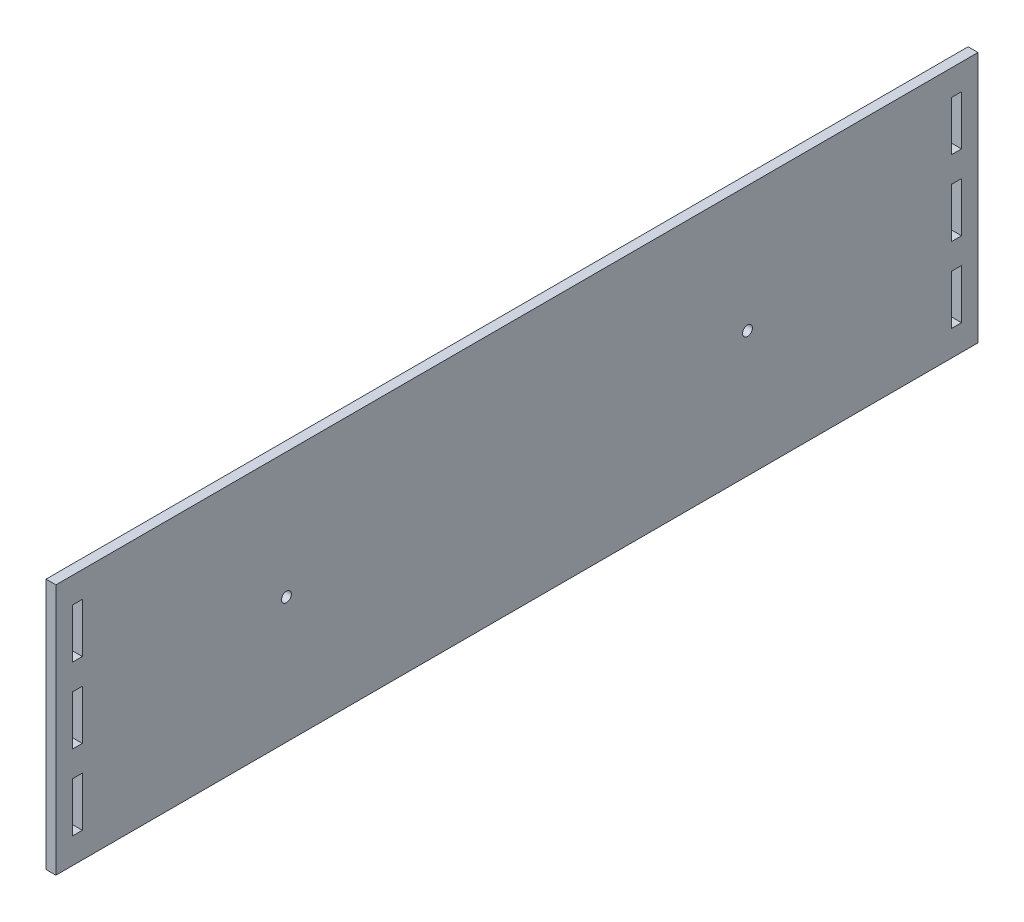
ISO-10303-21;
HEADER;
FILE_DESCRIPTION(('STEP AP214'),'2;1');
FILE_NAME('part.step','',(''),(''),'','','');
FILE_SCHEMA(('AUTOMOTIVE_DESIGN { 1 0 10303 214 1 1 1 1 }'));
ENDSEC;
DATA;
#1=APPLICATION_CONTEXT('core data for automotive mechanical design processes');
#2=APPLICATION_PROTOCOL_DEFINITION('international standard','automotive_design',2000,#1);
#3=PRODUCT_CONTEXT('',#1,'mechanical');
#4=PRODUCT('Part','Part','',(#3));
#5=PRODUCT_RELATED_PRODUCT_CATEGORY('part','',(#4));
#6=PRODUCT_DEFINITION_FORMATION('','',#4);
#7=PRODUCT_DEFINITION_CONTEXT('part definition',#1,'design');
#8=PRODUCT_DEFINITION('design','',#6,#7);
#9=PRODUCT_DEFINITION_SHAPE('','',#8);
#10=(LENGTH_UNIT() NAMED_UNIT(*) SI_UNIT(.MILLI.,.METRE.));
#11=(NAMED_UNIT(*) PLANE_ANGLE_UNIT() SI_UNIT($,.RADIAN.));
#12=(NAMED_UNIT(*) SI_UNIT($,.STERADIAN.) SOLID_ANGLE_UNIT());
#13=UNCERTAINTY_MEASURE_WITH_UNIT(LENGTH_MEASURE(1.E-05),#10,'distance_accuracy_value','');
#14=(GEOMETRIC_REPRESENTATION_CONTEXT(3) GLOBAL_UNCERTAINTY_ASSIGNED_CONTEXT((#13)) GLOBAL_UNIT_ASSIGNED_CONTEXT((#10,
#11,#12)) REPRESENTATION_CONTEXT('',''));
#15=CARTESIAN_POINT('',(0.,0.,0.));
#16=DIRECTION('',(0.,0.,1.));
#17=DIRECTION('',(1.,0.,0.));
#18=AXIS2_PLACEMENT_3D('',#15,#16,#17);
#19=CARTESIAN_POINT('',(-3.,0.,0.));
#20=DIRECTION('',(-1.,0.,0.));
#21=DIRECTION('',(0.,0.,1.));
#22=AXIS2_PLACEMENT_3D('',#19,#20,#21);
#23=PLANE('',#22);
#24=CARTESIAN_POINT('',(-3.,0.,-69.85));
#25=DIRECTION('',(-1.,0.,0.));
#26=DIRECTION('',(0.,0.,1.));
#27=AXIS2_PLACEMENT_3D('',#24,#25,#26);
#28=CIRCLE('',#27,1.5);
#29=CARTESIAN_POINT('',(-3.,0.,-68.35));
#30=VERTEX_POINT('',#29);
#31=EDGE_CURVE('E823',#30,#30,#28,.T.);
#32=ORIENTED_EDGE('',*,*,#31,.F.);
#33=EDGE_LOOP('',(#32));
#34=FACE_BOUND('',#33,.T.);
#35=CARTESIAN_POINT('',(-3.,0.,69.8500000000001));
#36=DIRECTION('',(-1.,0.,0.));
#37=DIRECTION('',(0.,0.,1.));
#38=AXIS2_PLACEMENT_3D('',#35,#36,#37);
#39=CIRCLE('',#38,1.5);
#40=CARTESIAN_POINT('',(-3.,0.,71.3500000000001));
#41=VERTEX_POINT('',#40);
#42=EDGE_CURVE('E825',#41,#41,#39,.T.);
#43=ORIENTED_EDGE('',*,*,#42,.F.);
#44=EDGE_LOOP('',(#43));
#45=FACE_BOUND('',#44,.T.);
#46=DIRECTION('',(0.,1.,0.));
#47=VECTOR('',#46,1.);
#48=CARTESIAN_POINT('',(-3.,7.50000000000002,134.7));
#49=LINE('',#48,#47);
#50=CARTESIAN_POINT('',(-3.,-7.49999999999998,134.7));
#51=VERTEX_POINT('',#50);
#52=CARTESIAN_POINT('',(-3.,7.50000000000002,134.7));
#53=VERTEX_POINT('',#52);
#54=EDGE_CURVE('E347',#51,#53,#49,.T.);
#55=ORIENTED_EDGE('',*,*,#54,.F.);
#56=DIRECTION('',(0.,0.,1.));
#57=VECTOR('',#56,1.);
#58=CARTESIAN_POINT('',(-3.,-7.49999999999998,134.7));
#59=LINE('',#58,#57);
#60=CARTESIAN_POINT('',(-3.,-7.49999999999997,131.7));
#61=VERTEX_POINT('',#60);
#62=EDGE_CURVE('E339',#61,#51,#59,.T.);
#63=ORIENTED_EDGE('',*,*,#62,.F.);
#64=DIRECTION('',(0.,-1.,0.));
#65=VECTOR('',#64,1.);
#66=CARTESIAN_POINT('',(-3.,7.50000000000003,131.7));
#67=LINE('',#66,#65);
#68=CARTESIAN_POINT('',(-3.,7.50000000000003,131.7));
#69=VERTEX_POINT('',#68);
#70=EDGE_CURVE('E331',#69,#61,#67,.T.);
#71=ORIENTED_EDGE('',*,*,#70,.F.);
#72=DIRECTION('',(0.,0.,-1.));
#73=VECTOR('',#72,1.);
#74=CARTESIAN_POINT('',(-3.,7.50000000000002,134.7));
#75=LINE('',#74,#73);
#76=EDGE_CURVE('E260',#53,#69,#75,.T.);
#77=ORIENTED_EDGE('',*,*,#76,.F.);
#78=EDGE_LOOP('',(#55,#63,#71,#77));
#79=FACE_BOUND('',#78,.T.);
#80=DIRECTION('',(0.,1.,0.));
#81=VECTOR('',#80,1.);
#82=CARTESIAN_POINT('',(-3.,30.3,134.7));
#83=LINE('',#82,#81);
#84=CARTESIAN_POINT('',(-3.,15.3,134.7));
#85=VERTEX_POINT('',#84);
#86=CARTESIAN_POINT('',(-3.,30.3,134.7));
#87=VERTEX_POINT('',#86);
#88=EDGE_CURVE('E352',#85,#87,#83,.T.);
#89=ORIENTED_EDGE('',*,*,#88,.F.);
#90=DIRECTION('',(0.,0.,1.));
#91=VECTOR('',#90,1.);
#92=CARTESIAN_POINT('',(-3.,15.3,134.7));
#93=LINE('',#92,#91);
#94=CARTESIAN_POINT('',(-3.,15.3,131.7));
#95=VERTEX_POINT('',#94);
#96=EDGE_CURVE('E357',#95,#85,#93,.T.);
#97=ORIENTED_EDGE('',*,*,#96,.F.);
#98=DIRECTION('',(0.,-1.,0.));
#99=VECTOR('',#98,1.);
#100=CARTESIAN_POINT('',(-3.,30.3,131.7));
#101=LINE('',#100,#99);
#102=CARTESIAN_POINT('',(-3.,30.3,131.7));
#103=VERTEX_POINT('',#102);
#104=EDGE_CURVE('E371',#103,#95,#101,.T.);
#105=ORIENTED_EDGE('',*,*,#104,.F.);
#106=DIRECTION('',(0.,0.,-1.));
#107=VECTOR('',#106,1.);
#108=CARTESIAN_POINT('',(-3.,30.3,134.7));
#109=LINE('',#108,#107);
#110=EDGE_CURVE('E368',#87,#103,#109,.T.);
#111=ORIENTED_EDGE('',*,*,#110,.F.);
#112=EDGE_LOOP('',(#89,#97,#105,#111));
#113=FACE_BOUND('',#112,.T.);
#114=DIRECTION('',(0.,0.,-1.));
#115=VECTOR('',#114,1.);
#116=CARTESIAN_POINT('',(-3.,38.1,139.7));
#117=LINE('',#116,#115);
#118=CARTESIAN_POINT('',(-3.,38.1,139.7));
#119=VERTEX_POINT('',#118);
#120=CARTESIAN_POINT('',(-3.,38.1,-139.7));
#121=VERTEX_POINT('',#120);
#122=EDGE_CURVE('E385',#119,#121,#117,.T.);
#123=ORIENTED_EDGE('',*,*,#122,.T.);
#124=DIRECTION('',(0.,-1.,0.));
#125=VECTOR('',#124,1.);
#126=CARTESIAN_POINT('',(-3.,38.1,-139.7));
#127=LINE('',#126,#125);
#128=CARTESIAN_POINT('',(-3.,-38.1,-139.7));
#129=VERTEX_POINT('',#128);
#130=EDGE_CURVE('E388',#121,#129,#127,.T.);
#131=ORIENTED_EDGE('',*,*,#130,.T.);
#132=DIRECTION('',(0.,0.,-1.));
#133=VECTOR('',#132,1.);
#134=CARTESIAN_POINT('',(-3.,-38.1,139.7));
#135=LINE('',#134,#133);
#136=CARTESIAN_POINT('',(-3.,-38.1,139.7));
#137=VERTEX_POINT('',#136);
#138=EDGE_CURVE('E391',#137,#129,#135,.T.);
#139=ORIENTED_EDGE('',*,*,#138,.F.);
#140=DIRECTION('',(0.,-1.,0.));
#141=VECTOR('',#140,1.);
#142=CARTESIAN_POINT('',(-3.,38.1,139.7));
#143=LINE('',#142,#141);
#144=EDGE_CURVE('E394',#119,#137,#143,.T.);
#145=ORIENTED_EDGE('',*,*,#144,.F.);
#146=EDGE_LOOP('',(#123,#131,#139,#145));
#147=FACE_BOUND('',#146,.T.);
#148=DIRECTION('',(0.,1.,0.));
#149=VECTOR('',#148,1.);
#150=CARTESIAN_POINT('',(-3.,-15.3,134.7));
#151=LINE('',#150,#149);
#152=CARTESIAN_POINT('',(-3.,-30.3,134.7));
#153=VERTEX_POINT('',#152);
#154=CARTESIAN_POINT('',(-3.,-15.3,134.7));
#155=VERTEX_POINT('',#154);
#156=EDGE_CURVE('E416',#153,#155,#151,.T.);
#157=ORIENTED_EDGE('',*,*,#156,.F.);
#158=DIRECTION('',(0.,0.,1.));
#159=VECTOR('',#158,1.);
#160=CARTESIAN_POINT('',(-3.,-30.3,134.7));
#161=LINE('',#160,#159);
#162=CARTESIAN_POINT('',(-3.,-30.3,131.7));
#163=VERTEX_POINT('',#162);
#164=EDGE_CURVE('E418',#163,#153,#161,.T.);
#165=ORIENTED_EDGE('',*,*,#164,.F.);
#166=DIRECTION('',(0.,-1.,0.));
#167=VECTOR('',#166,1.);
#168=CARTESIAN_POINT('',(-3.,-15.3,131.7));
#169=LINE('',#168,#167);
#170=CARTESIAN_POINT('',(-3.,-15.3,131.7));
#171=VERTEX_POINT('',#170);
#172=EDGE_CURVE('E421',#171,#163,#169,.T.);
#173=ORIENTED_EDGE('',*,*,#172,.F.);
#174=DIRECTION('',(0.,0.,-1.));
#175=VECTOR('',#174,1.);
#176=CARTESIAN_POINT('',(-3.,-15.3,134.7));
#177=LINE('',#176,#175);
#178=EDGE_CURVE('E424',#155,#171,#177,.T.);
#179=ORIENTED_EDGE('',*,*,#178,.F.);
#180=EDGE_LOOP('',(#157,#165,#173,#179));
#181=FACE_BOUND('',#180,.T.);
#182=DIRECTION('',(0.,0.,-1.));
#183=VECTOR('',#182,1.);
#184=CARTESIAN_POINT('',(-3.,-30.3,-134.7));
#185=LINE('',#184,#183);
#186=CARTESIAN_POINT('',(-3.,-30.3,-131.7));
#187=VERTEX_POINT('',#186);
#188=CARTESIAN_POINT('',(-3.,-30.3,-134.7));
#189=VERTEX_POINT('',#188);
#190=EDGE_CURVE('E305',#187,#189,#185,.T.);
#191=ORIENTED_EDGE('',*,*,#190,.T.);
#192=DIRECTION('',(0.,1.,0.));
#193=VECTOR('',#192,1.);
#194=CARTESIAN_POINT('',(-3.,-15.3,-134.7));
#195=LINE('',#194,#193);
#196=CARTESIAN_POINT('',(-3.,-15.3,-134.7));
#197=VERTEX_POINT('',#196);
#198=EDGE_CURVE('E302',#189,#197,#195,.T.);
#199=ORIENTED_EDGE('',*,*,#198,.T.);
#200=DIRECTION('',(0.,0.,1.));
#201=VECTOR('',#200,1.);
#202=CARTESIAN_POINT('',(-3.,-15.3,-134.7));
#203=LINE('',#202,#201);
#204=CARTESIAN_POINT('',(-3.,-15.3,-131.7));
#205=VERTEX_POINT('',#204);
#206=EDGE_CURVE('E294',#197,#205,#203,.T.);
#207=ORIENTED_EDGE('',*,*,#206,.T.);
#208=DIRECTION('',(0.,-1.,0.));
#209=VECTOR('',#208,1.);
#210=CARTESIAN_POINT('',(-3.,-15.3,-131.7));
#211=LINE('',#210,#209);
#212=EDGE_CURVE('E308',#205,#187,#211,.T.);
#213=ORIENTED_EDGE('',*,*,#212,.T.);
#214=EDGE_LOOP('',(#191,#199,#207,#213));
#215=FACE_BOUND('',#214,.T.);
#216=DIRECTION('',(0.,0.,-1.));
#217=VECTOR('',#216,1.);
#218=CARTESIAN_POINT('',(-3.,-7.49999999999998,-134.7));
#219=LINE('',#218,#217);
#220=CARTESIAN_POINT('',(-3.,-7.49999999999997,-131.7));
#221=VERTEX_POINT('',#220);
#222=CARTESIAN_POINT('',(-3.,-7.49999999999998,-134.7));
#223=VERTEX_POINT('',#222);
#224=EDGE_CURVE('E276',#221,#223,#219,.T.);
#225=ORIENTED_EDGE('',*,*,#224,.T.);
#226=DIRECTION('',(0.,1.,0.));
#227=VECTOR('',#226,1.);
#228=CARTESIAN_POINT('',(-3.,7.50000000000002,-134.7));
#229=LINE('',#228,#227);
#230=CARTESIAN_POINT('',(-3.,7.50000000000002,-134.7));
#231=VERTEX_POINT('',#230);
#232=EDGE_CURVE('E57',#223,#231,#229,.T.);
#233=ORIENTED_EDGE('',*,*,#232,.T.);
#234=DIRECTION('',(0.,0.,1.));
#235=VECTOR('',#234,1.);
#236=CARTESIAN_POINT('',(-3.,7.50000000000002,-134.7));
#237=LINE('',#236,#235);
#238=CARTESIAN_POINT('',(-3.,7.50000000000003,-131.7));
#239=VERTEX_POINT('',#238);
#240=EDGE_CURVE('E267',#231,#239,#237,.T.);
#241=ORIENTED_EDGE('',*,*,#240,.T.);
#242=DIRECTION('',(0.,-1.,0.));
#243=VECTOR('',#242,1.);
#244=CARTESIAN_POINT('',(-3.,7.50000000000003,-131.7));
#245=LINE('',#244,#243);
#246=EDGE_CURVE('E280',#239,#221,#245,.T.);
#247=ORIENTED_EDGE('',*,*,#246,.T.);
#248=EDGE_LOOP('',(#225,#233,#241,#247));
#249=FACE_BOUND('',#248,.T.);
#250=DIRECTION('',(0.,0.,-1.));
#251=VECTOR('',#250,1.);
#252=CARTESIAN_POINT('',(-3.,15.3,-134.7));
#253=LINE('',#252,#251);
#254=CARTESIAN_POINT('',(-3.,15.3,-131.7));
#255=VERTEX_POINT('',#254);
#256=CARTESIAN_POINT('',(-3.,15.3,-134.7));
#257=VERTEX_POINT('',#256);
#258=EDGE_CURVE('E253',#255,#257,#253,.T.);
#259=ORIENTED_EDGE('',*,*,#258,.T.);
#260=DIRECTION('',(0.,1.,0.));
#261=VECTOR('',#260,1.);
#262=CARTESIAN_POINT('',(-3.,30.3,-134.7));
#263=LINE('',#262,#261);
#264=CARTESIAN_POINT('',(-3.,30.3,-134.7));
#265=VERTEX_POINT('',#264);
#266=EDGE_CURVE('E49',#257,#265,#263,.T.);
#267=ORIENTED_EDGE('',*,*,#266,.T.);
#268=DIRECTION('',(0.,0.,1.));
#269=VECTOR('',#268,1.);
#270=CARTESIAN_POINT('',(-3.,30.3,-134.7));
#271=LINE('',#270,#269);
#272=CARTESIAN_POINT('',(-3.,30.3,-131.7));
#273=VERTEX_POINT('',#272);
#274=EDGE_CURVE('E241',#265,#273,#271,.T.);
#275=ORIENTED_EDGE('',*,*,#274,.T.);
#276=DIRECTION('',(0.,-1.,0.));
#277=VECTOR('',#276,1.);
#278=CARTESIAN_POINT('',(-3.,30.3,-131.7));
#279=LINE('',#278,#277);
#280=EDGE_CURVE('E244',#273,#255,#279,.T.);
#281=ORIENTED_EDGE('',*,*,#280,.T.);
#282=EDGE_LOOP('',(#259,#267,#275,#281));
#283=FACE_BOUND('',#282,.T.);
#284=ADVANCED_FACE('F34',(#34,#45,#79,#113,#147,#181,#215,#249,#283),#23,.T.);
#285=CARTESIAN_POINT('',(0.,0.,0.));
#286=DIRECTION('',(-1.,0.,0.));
#287=DIRECTION('',(0.,0.,1.));
#288=AXIS2_PLACEMENT_3D('',#285,#286,#287);
#289=PLANE('',#288);
#290=CARTESIAN_POINT('',(0.,0.,-69.85));
#291=DIRECTION('',(-1.,0.,0.));
#292=DIRECTION('',(0.,0.,1.));
#293=AXIS2_PLACEMENT_3D('',#290,#291,#292);
#294=CIRCLE('',#293,1.5);
#295=CARTESIAN_POINT('',(0.,0.,-68.35));
#296=VERTEX_POINT('',#295);
#297=EDGE_CURVE('E821',#296,#296,#294,.T.);
#298=ORIENTED_EDGE('',*,*,#297,.T.);
#299=EDGE_LOOP('',(#298));
#300=FACE_BOUND('',#299,.T.);
#301=CARTESIAN_POINT('',(0.,0.,69.8500000000001));
#302=DIRECTION('',(-1.,0.,0.));
#303=DIRECTION('',(0.,0.,1.));
#304=AXIS2_PLACEMENT_3D('',#301,#302,#303);
#305=CIRCLE('',#304,1.5);
#306=CARTESIAN_POINT('',(0.,0.,71.3500000000001));
#307=VERTEX_POINT('',#306);
#308=EDGE_CURVE('E247',#307,#307,#305,.T.);
#309=ORIENTED_EDGE('',*,*,#308,.T.);
#310=EDGE_LOOP('',(#309));
#311=FACE_BOUND('',#310,.T.);
#312=DIRECTION('',(0.,1.,0.));
#313=VECTOR('',#312,1.);
#314=CARTESIAN_POINT('',(0.,7.50000000000002,-134.7));
#315=LINE('',#314,#313);
#316=CARTESIAN_POINT('',(0.,-7.49999999999998,-134.7));
#317=VERTEX_POINT('',#316);
#318=CARTESIAN_POINT('',(0.,7.50000000000002,-134.7));
#319=VERTEX_POINT('',#318);
#320=EDGE_CURVE('E264',#317,#319,#315,.T.);
#321=ORIENTED_EDGE('',*,*,#320,.F.);
#322=DIRECTION('',(0.,0.,-1.));
#323=VECTOR('',#322,1.);
#324=CARTESIAN_POINT('',(0.,-7.49999999999998,-134.7));
#325=LINE('',#324,#323);
#326=CARTESIAN_POINT('',(0.,-7.49999999999997,-131.7));
#327=VERTEX_POINT('',#326);
#328=EDGE_CURVE('E266',#327,#317,#325,.T.);
#329=ORIENTED_EDGE('',*,*,#328,.F.);
#330=DIRECTION('',(0.,-1.,0.));
#331=VECTOR('',#330,1.);
#332=CARTESIAN_POINT('',(0.,7.50000000000003,-131.7));
#333=LINE('',#332,#331);
#334=CARTESIAN_POINT('',(0.,7.50000000000003,-131.7));
#335=VERTEX_POINT('',#334);
#336=EDGE_CURVE('E269',#335,#327,#333,.T.);
#337=ORIENTED_EDGE('',*,*,#336,.F.);
#338=DIRECTION('',(0.,0.,1.));
#339=VECTOR('',#338,1.);
#340=CARTESIAN_POINT('',(0.,7.50000000000002,-134.7));
#341=LINE('',#340,#339);
#342=EDGE_CURVE('E272',#319,#335,#341,.T.);
#343=ORIENTED_EDGE('',*,*,#342,.F.);
#344=EDGE_LOOP('',(#321,#329,#337,#343));
#345=FACE_BOUND('',#344,.T.);
#346=DIRECTION('',(0.,1.,0.));
#347=VECTOR('',#346,1.);
#348=CARTESIAN_POINT('',(0.,-15.3,134.7));
#349=LINE('',#348,#347);
#350=CARTESIAN_POINT('',(0.,-30.3,134.7));
#351=VERTEX_POINT('',#350);
#352=CARTESIAN_POINT('',(0.,-15.3,134.7));
#353=VERTEX_POINT('',#352);
#354=EDGE_CURVE('E427',#351,#353,#349,.T.);
#355=ORIENTED_EDGE('',*,*,#354,.T.);
#356=DIRECTION('',(0.,0.,-1.));
#357=VECTOR('',#356,1.);
#358=CARTESIAN_POINT('',(0.,-15.3,134.7));
#359=LINE('',#358,#357);
#360=CARTESIAN_POINT('',(0.,-15.3,131.7));
#361=VERTEX_POINT('',#360);
#362=EDGE_CURVE('E429',#353,#361,#359,.T.);
#363=ORIENTED_EDGE('',*,*,#362,.T.);
#364=DIRECTION('',(0.,-1.,0.));
#365=VECTOR('',#364,1.);
#366=CARTESIAN_POINT('',(0.,-15.3,131.7));
#367=LINE('',#366,#365);
#368=CARTESIAN_POINT('',(0.,-30.3,131.7));
#369=VERTEX_POINT('',#368);
#370=EDGE_CURVE('E431',#361,#369,#367,.T.);
#371=ORIENTED_EDGE('',*,*,#370,.T.);
#372=DIRECTION('',(0.,0.,1.));
#373=VECTOR('',#372,1.);
#374=CARTESIAN_POINT('',(0.,-30.3,134.7));
#375=LINE('',#374,#373);
#376=EDGE_CURVE('E433',#369,#351,#375,.T.);
#377=ORIENTED_EDGE('',*,*,#376,.T.);
#378=EDGE_LOOP('',(#355,#363,#371,#377));
#379=FACE_BOUND('',#378,.T.);
#380=DIRECTION('',(0.,0.,-1.));
#381=VECTOR('',#380,1.);
#382=CARTESIAN_POINT('',(0.,38.1,139.7));
#383=LINE('',#382,#381);
#384=CARTESIAN_POINT('',(0.,38.1,139.7));
#385=VERTEX_POINT('',#384);
#386=CARTESIAN_POINT('',(0.,38.1,-139.7));
#387=VERTEX_POINT('',#386);
#388=EDGE_CURVE('E378',#385,#387,#383,.T.);
#389=ORIENTED_EDGE('',*,*,#388,.F.);
#390=DIRECTION('',(0.,-1.,0.));
#391=VECTOR('',#390,1.);
#392=CARTESIAN_POINT('',(0.,38.1,139.7));
#393=LINE('',#392,#391);
#394=CARTESIAN_POINT('',(0.,-38.1,139.7));
#395=VERTEX_POINT('',#394);
#396=EDGE_CURVE('E389',#385,#395,#393,.T.);
#397=ORIENTED_EDGE('',*,*,#396,.T.);
#398=DIRECTION('',(0.,0.,-1.));
#399=VECTOR('',#398,1.);
#400=CARTESIAN_POINT('',(0.,-38.1,139.7));
#401=LINE('',#400,#399);
#402=CARTESIAN_POINT('',(0.,-38.1,-139.7));
#403=VERTEX_POINT('',#402);
#404=EDGE_CURVE('E403',#395,#403,#401,.T.);
#405=ORIENTED_EDGE('',*,*,#404,.T.);
#406=DIRECTION('',(0.,-1.,0.));
#407=VECTOR('',#406,1.);
#408=CARTESIAN_POINT('',(0.,38.1,-139.7));
#409=LINE('',#408,#407);
#410=EDGE_CURVE('E400',#387,#403,#409,.T.);
#411=ORIENTED_EDGE('',*,*,#410,.F.);
#412=EDGE_LOOP('',(#389,#397,#405,#411));
#413=FACE_BOUND('',#412,.T.);
#414=DIRECTION('',(0.,0.,1.));
#415=VECTOR('',#414,1.);
#416=CARTESIAN_POINT('',(0.,15.3,134.7));
#417=LINE('',#416,#415);
#418=CARTESIAN_POINT('',(0.,15.3,131.7));
#419=VERTEX_POINT('',#418);
#420=CARTESIAN_POINT('',(0.,15.3,134.7));
#421=VERTEX_POINT('',#420);
#422=EDGE_CURVE('E363',#419,#421,#417,.T.);
#423=ORIENTED_EDGE('',*,*,#422,.T.);
#424=DIRECTION('',(0.,1.,0.));
#425=VECTOR('',#424,1.);
#426=CARTESIAN_POINT('',(0.,30.3,134.7));
#427=LINE('',#426,#425);
#428=CARTESIAN_POINT('',(0.,30.3,134.7));
#429=VERTEX_POINT('',#428);
#430=EDGE_CURVE('E353',#421,#429,#427,.T.);
#431=ORIENTED_EDGE('',*,*,#430,.T.);
#432=DIRECTION('',(0.,0.,-1.));
#433=VECTOR('',#432,1.);
#434=CARTESIAN_POINT('',(0.,30.3,134.7));
#435=LINE('',#434,#433);
#436=CARTESIAN_POINT('',(0.,30.3,131.7));
#437=VERTEX_POINT('',#436);
#438=EDGE_CURVE('E356',#429,#437,#435,.T.);
#439=ORIENTED_EDGE('',*,*,#438,.T.);
#440=DIRECTION('',(0.,-1.,0.));
#441=VECTOR('',#440,1.);
#442=CARTESIAN_POINT('',(0.,30.3,131.7));
#443=LINE('',#442,#441);
#444=EDGE_CURVE('E360',#437,#419,#443,.T.);
#445=ORIENTED_EDGE('',*,*,#444,.T.);
#446=EDGE_LOOP('',(#423,#431,#439,#445));
#447=FACE_BOUND('',#446,.T.);
#448=DIRECTION('',(0.,0.,1.));
#449=VECTOR('',#448,1.);
#450=CARTESIAN_POINT('',(0.,-7.49999999999998,134.7));
#451=LINE('',#450,#449);
#452=CARTESIAN_POINT('',(0.,-7.49999999999997,131.7));
#453=VERTEX_POINT('',#452);
#454=CARTESIAN_POINT('',(0.,-7.49999999999998,134.7));
#455=VERTEX_POINT('',#454);
#456=EDGE_CURVE('E344',#453,#455,#451,.T.);
#457=ORIENTED_EDGE('',*,*,#456,.T.);
#458=DIRECTION('',(0.,1.,0.));
#459=VECTOR('',#458,1.);
#460=CARTESIAN_POINT('',(0.,7.50000000000002,134.7));
#461=LINE('',#460,#459);
#462=CARTESIAN_POINT('',(0.,7.50000000000002,134.7));
#463=VERTEX_POINT('',#462);
#464=EDGE_CURVE('E349',#455,#463,#461,.T.);
#465=ORIENTED_EDGE('',*,*,#464,.T.);
#466=DIRECTION('',(0.,0.,-1.));
#467=VECTOR('',#466,1.);
#468=CARTESIAN_POINT('',(0.,7.50000000000002,134.7));
#469=LINE('',#468,#467);
#470=CARTESIAN_POINT('',(0.,7.50000000000003,131.7));
#471=VERTEX_POINT('',#470);
#472=EDGE_CURVE('E322',#463,#471,#469,.T.);
#473=ORIENTED_EDGE('',*,*,#472,.T.);
#474=DIRECTION('',(0.,-1.,0.));
#475=VECTOR('',#474,1.);
#476=CARTESIAN_POINT('',(0.,7.50000000000003,131.7));
#477=LINE('',#476,#475);
#478=EDGE_CURVE('E336',#471,#453,#477,.T.);
#479=ORIENTED_EDGE('',*,*,#478,.T.);
#480=EDGE_LOOP('',(#457,#465,#473,#479));
#481=FACE_BOUND('',#480,.T.);
#482=DIRECTION('',(0.,1.,0.));
#483=VECTOR('',#482,1.);
#484=CARTESIAN_POINT('',(0.,-15.3,-134.7));
#485=LINE('',#484,#483);
#486=CARTESIAN_POINT('',(0.,-30.3,-134.7));
#487=VERTEX_POINT('',#486);
#488=CARTESIAN_POINT('',(0.,-15.3,-134.7));
#489=VERTEX_POINT('',#488);
#490=EDGE_CURVE('E291',#487,#489,#485,.T.);
#491=ORIENTED_EDGE('',*,*,#490,.F.);
#492=DIRECTION('',(0.,0.,-1.));
#493=VECTOR('',#492,1.);
#494=CARTESIAN_POINT('',(0.,-30.3,-134.7));
#495=LINE('',#494,#493);
#496=CARTESIAN_POINT('',(0.,-30.3,-131.7));
#497=VERTEX_POINT('',#496);
#498=EDGE_CURVE('E293',#497,#487,#495,.T.);
#499=ORIENTED_EDGE('',*,*,#498,.F.);
#500=DIRECTION('',(0.,-1.,0.));
#501=VECTOR('',#500,1.);
#502=CARTESIAN_POINT('',(0.,-15.3,-131.7));
#503=LINE('',#502,#501);
#504=CARTESIAN_POINT('',(0.,-15.3,-131.7));
#505=VERTEX_POINT('',#504);
#506=EDGE_CURVE('E296',#505,#497,#503,.T.);
#507=ORIENTED_EDGE('',*,*,#506,.F.);
#508=DIRECTION('',(0.,0.,1.));
#509=VECTOR('',#508,1.);
#510=CARTESIAN_POINT('',(0.,-15.3,-134.7));
#511=LINE('',#510,#509);
#512=EDGE_CURVE('E299',#489,#505,#511,.T.);
#513=ORIENTED_EDGE('',*,*,#512,.F.);
#514=EDGE_LOOP('',(#491,#499,#507,#513));
#515=FACE_BOUND('',#514,.T.);
#516=DIRECTION('',(0.,1.,0.));
#517=VECTOR('',#516,1.);
#518=CARTESIAN_POINT('',(0.,30.3,-134.7));
#519=LINE('',#518,#517);
#520=CARTESIAN_POINT('',(0.,15.3,-134.7));
#521=VERTEX_POINT('',#520);
#522=CARTESIAN_POINT('',(0.,30.3,-134.7));
#523=VERTEX_POINT('',#522);
#524=EDGE_CURVE('E233',#521,#523,#519,.T.);
#525=ORIENTED_EDGE('',*,*,#524,.F.);
#526=DIRECTION('',(0.,0.,-1.));
#527=VECTOR('',#526,1.);
#528=CARTESIAN_POINT('',(0.,15.3,-134.7));
#529=LINE('',#528,#527);
#530=CARTESIAN_POINT('',(0.,15.3,-131.7));
#531=VERTEX_POINT('',#530);
#532=EDGE_CURVE('E222',#531,#521,#529,.T.);
#533=ORIENTED_EDGE('',*,*,#532,.F.);
#534=DIRECTION('',(0.,-1.,0.));
#535=VECTOR('',#534,1.);
#536=CARTESIAN_POINT('',(0.,30.3,-131.7));
#537=LINE('',#536,#535);
#538=CARTESIAN_POINT('',(0.,30.3,-131.7));
#539=VERTEX_POINT('',#538);
#540=EDGE_CURVE('E232',#539,#531,#537,.T.);
#541=ORIENTED_EDGE('',*,*,#540,.F.);
#542=DIRECTION('',(0.,0.,1.));
#543=VECTOR('',#542,1.);
#544=CARTESIAN_POINT('',(0.,30.3,-134.7));
#545=LINE('',#544,#543);
#546=EDGE_CURVE('E237',#523,#539,#545,.T.);
#547=ORIENTED_EDGE('',*,*,#546,.F.);
#548=EDGE_LOOP('',(#525,#533,#541,#547));
#549=FACE_BOUND('',#548,.T.);
#550=ADVANCED_FACE('F240',(#300,#311,#345,#379,#413,#447,#481,#515,#549),#289,.F.);
#551=CARTESIAN_POINT('',(0.,-15.3,134.7));
#552=DIRECTION('',(0.,1.,0.));
#553=DIRECTION('',(0.,0.,1.));
#554=AXIS2_PLACEMENT_3D('',#551,#552,#553);
#555=PLANE('',#554);
#556=ORIENTED_EDGE('',*,*,#178,.T.);
#557=DIRECTION('',(-1.,0.,0.));
#558=VECTOR('',#557,1.);
#559=CARTESIAN_POINT('',(0.,-15.3,131.7));
#560=LINE('',#559,#558);
#561=EDGE_CURVE('E11',#361,#171,#560,.T.);
#562=ORIENTED_EDGE('',*,*,#561,.F.);
#563=ORIENTED_EDGE('',*,*,#362,.F.);
#564=DIRECTION('',(-1.,0.,0.));
#565=VECTOR('',#564,1.);
#566=CARTESIAN_POINT('',(0.,-15.3,134.7));
#567=LINE('',#566,#565);
#568=EDGE_CURVE('E436',#353,#155,#567,.T.);
#569=ORIENTED_EDGE('',*,*,#568,.T.);
#570=EDGE_LOOP('',(#556,#562,#563,#569));
#571=FACE_BOUND('',#570,.T.);
#572=ADVANCED_FACE('F36',(#571),#555,.F.);
#573=CARTESIAN_POINT('',(0.,-15.3,131.7));
#574=DIRECTION('',(0.,0.,-1.));
#575=DIRECTION('',(-1.,0.,0.));
#576=AXIS2_PLACEMENT_3D('',#573,#574,#575);
#577=PLANE('',#576);
#578=ORIENTED_EDGE('',*,*,#172,.T.);
#579=DIRECTION('',(-1.,0.,0.));
#580=VECTOR('',#579,1.);
#581=CARTESIAN_POINT('',(0.,-30.3,131.7));
#582=LINE('',#581,#580);
#583=EDGE_CURVE('E42',#369,#163,#582,.T.);
#584=ORIENTED_EDGE('',*,*,#583,.F.);
#585=ORIENTED_EDGE('',*,*,#370,.F.);
#586=ORIENTED_EDGE('',*,*,#561,.T.);
#587=EDGE_LOOP('',(#578,#584,#585,#586));
#588=FACE_BOUND('',#587,.T.);
#589=ADVANCED_FACE('F449',(#588),#577,.F.);
#590=CARTESIAN_POINT('',(0.,-30.3,134.7));
#591=DIRECTION('',(0.,-1.,0.));
#592=DIRECTION('',(0.,0.,-1.));
#593=AXIS2_PLACEMENT_3D('',#590,#591,#592);
#594=PLANE('',#593);
#595=ORIENTED_EDGE('',*,*,#164,.T.);
#596=DIRECTION('',(-1.,0.,0.));
#597=VECTOR('',#596,1.);
#598=CARTESIAN_POINT('',(0.,-30.3,134.7));
#599=LINE('',#598,#597);
#600=EDGE_CURVE('E439',#351,#153,#599,.T.);
#601=ORIENTED_EDGE('',*,*,#600,.F.);
#602=ORIENTED_EDGE('',*,*,#376,.F.);
#603=ORIENTED_EDGE('',*,*,#583,.T.);
#604=EDGE_LOOP('',(#595,#601,#602,#603));
#605=FACE_BOUND('',#604,.T.);
#606=ADVANCED_FACE('F445',(#605),#594,.F.);
#607=CARTESIAN_POINT('',(0.,-15.3,134.7));
#608=DIRECTION('',(0.,0.,1.));
#609=DIRECTION('',(1.,0.,0.));
#610=AXIS2_PLACEMENT_3D('',#607,#608,#609);
#611=PLANE('',#610);
#612=ORIENTED_EDGE('',*,*,#156,.T.);
#613=ORIENTED_EDGE('',*,*,#568,.F.);
#614=ORIENTED_EDGE('',*,*,#354,.F.);
#615=ORIENTED_EDGE('',*,*,#600,.T.);
#616=EDGE_LOOP('',(#612,#613,#614,#615));
#617=FACE_BOUND('',#616,.T.);
#618=ADVANCED_FACE('F458',(#617),#611,.F.);
#619=CARTESIAN_POINT('',(-3.,38.1,139.7));
#620=DIRECTION('',(0.,-1.,0.));
#621=DIRECTION('',(0.,0.,-1.));
#622=AXIS2_PLACEMENT_3D('',#619,#620,#621);
#623=PLANE('',#622);
#624=ORIENTED_EDGE('',*,*,#388,.T.);
#625=DIRECTION('',(1.,0.,0.));
#626=VECTOR('',#625,1.);
#627=CARTESIAN_POINT('',(-3.,38.1,-139.7));
#628=LINE('',#627,#626);
#629=EDGE_CURVE('E413',#121,#387,#628,.T.);
#630=ORIENTED_EDGE('',*,*,#629,.F.);
#631=ORIENTED_EDGE('',*,*,#122,.F.);
#632=DIRECTION('',(1.,0.,0.));
#633=VECTOR('',#632,1.);
#634=CARTESIAN_POINT('',(-3.,38.1,139.7));
#635=LINE('',#634,#633);
#636=EDGE_CURVE('E397',#119,#385,#635,.T.);
#637=ORIENTED_EDGE('',*,*,#636,.T.);
#638=EDGE_LOOP('',(#624,#630,#631,#637));
#639=FACE_BOUND('',#638,.T.);
#640=ADVANCED_FACE('F520',(#639),#623,.F.);
#641=CARTESIAN_POINT('',(-3.,38.1,-139.7));
#642=DIRECTION('',(0.,0.,1.));
#643=DIRECTION('',(0.,-1.,0.));
#644=AXIS2_PLACEMENT_3D('',#641,#642,#643);
#645=PLANE('',#644);
#646=ORIENTED_EDGE('',*,*,#410,.T.);
#647=DIRECTION('',(1.,0.,0.));
#648=VECTOR('',#647,1.);
#649=CARTESIAN_POINT('',(-3.,-38.1,-139.7));
#650=LINE('',#649,#648);
#651=EDGE_CURVE('E411',#129,#403,#650,.T.);
#652=ORIENTED_EDGE('',*,*,#651,.F.);
#653=ORIENTED_EDGE('',*,*,#130,.F.);
#654=ORIENTED_EDGE('',*,*,#629,.T.);
#655=EDGE_LOOP('',(#646,#652,#653,#654));
#656=FACE_BOUND('',#655,.T.);
#657=ADVANCED_FACE('F516',(#656),#645,.F.);
#658=CARTESIAN_POINT('',(-3.,-38.1,139.7));
#659=DIRECTION('',(0.,-1.,0.));
#660=DIRECTION('',(0.,0.,-1.));
#661=AXIS2_PLACEMENT_3D('',#658,#659,#660);
#662=PLANE('',#661);
#663=ORIENTED_EDGE('',*,*,#404,.F.);
#664=DIRECTION('',(1.,0.,0.));
#665=VECTOR('',#664,1.);
#666=CARTESIAN_POINT('',(-3.,-38.1,139.7));
#667=LINE('',#666,#665);
#668=EDGE_CURVE('E409',#137,#395,#667,.T.);
#669=ORIENTED_EDGE('',*,*,#668,.F.);
#670=ORIENTED_EDGE('',*,*,#138,.T.);
#671=ORIENTED_EDGE('',*,*,#651,.T.);
#672=EDGE_LOOP('',(#663,#669,#670,#671));
#673=FACE_BOUND('',#672,.T.);
#674=ADVANCED_FACE('F512',(#673),#662,.T.);
#675=CARTESIAN_POINT('',(-3.,38.1,139.7));
#676=DIRECTION('',(0.,0.,1.));
#677=DIRECTION('',(1.,0.,0.));
#678=AXIS2_PLACEMENT_3D('',#675,#676,#677);
#679=PLANE('',#678);
#680=ORIENTED_EDGE('',*,*,#396,.F.);
#681=ORIENTED_EDGE('',*,*,#636,.F.);
#682=ORIENTED_EDGE('',*,*,#144,.T.);
#683=ORIENTED_EDGE('',*,*,#668,.T.);
#684=EDGE_LOOP('',(#680,#681,#682,#683));
#685=FACE_BOUND('',#684,.T.);
#686=ADVANCED_FACE('F509',(#685),#679,.T.);
#687=CARTESIAN_POINT('',(0.,30.3,134.7));
#688=DIRECTION('',(0.,0.,1.));
#689=DIRECTION('',(1.,0.,0.));
#690=AXIS2_PLACEMENT_3D('',#687,#688,#689);
#691=PLANE('',#690);
#692=ORIENTED_EDGE('',*,*,#88,.T.);
#693=DIRECTION('',(-1.,0.,0.));
#694=VECTOR('',#693,1.);
#695=CARTESIAN_POINT('',(0.,30.3,134.7));
#696=LINE('',#695,#694);
#697=EDGE_CURVE('E366',#429,#87,#696,.T.);
#698=ORIENTED_EDGE('',*,*,#697,.F.);
#699=ORIENTED_EDGE('',*,*,#430,.F.);
#700=DIRECTION('',(-1.,0.,0.));
#701=VECTOR('',#700,1.);
#702=CARTESIAN_POINT('',(0.,15.3,134.7));
#703=LINE('',#702,#701);
#704=EDGE_CURVE('E376',#421,#85,#703,.T.);
#705=ORIENTED_EDGE('',*,*,#704,.T.);
#706=EDGE_LOOP('',(#692,#698,#699,#705));
#707=FACE_BOUND('',#706,.T.);
#708=ADVANCED_FACE('F506',(#707),#691,.F.);
#709=CARTESIAN_POINT('',(0.,15.3,134.7));
#710=DIRECTION('',(0.,-1.,0.));
#711=DIRECTION('',(0.,0.,-1.));
#712=AXIS2_PLACEMENT_3D('',#709,#710,#711);
#713=PLANE('',#712);
#714=ORIENTED_EDGE('',*,*,#96,.T.);
#715=ORIENTED_EDGE('',*,*,#704,.F.);
#716=ORIENTED_EDGE('',*,*,#422,.F.);
#717=DIRECTION('',(-1.,0.,0.));
#718=VECTOR('',#717,1.);
#719=CARTESIAN_POINT('',(0.,15.3,131.7));
#720=LINE('',#719,#718);
#721=EDGE_CURVE('E379',#419,#95,#720,.T.);
#722=ORIENTED_EDGE('',*,*,#721,.T.);
#723=EDGE_LOOP('',(#714,#715,#716,#722));
#724=FACE_BOUND('',#723,.T.);
#725=ADVANCED_FACE('F738',(#724),#713,.F.);
#726=CARTESIAN_POINT('',(0.,30.3,131.7));
#727=DIRECTION('',(0.,0.,-1.));
#728=DIRECTION('',(-1.,0.,0.));
#729=AXIS2_PLACEMENT_3D('',#726,#727,#728);
#730=PLANE('',#729);
#731=ORIENTED_EDGE('',*,*,#104,.T.);
#732=ORIENTED_EDGE('',*,*,#721,.F.);
#733=ORIENTED_EDGE('',*,*,#444,.F.);
#734=DIRECTION('',(-1.,0.,0.));
#735=VECTOR('',#734,1.);
#736=CARTESIAN_POINT('',(0.,30.3,131.7));
#737=LINE('',#736,#735);
#738=EDGE_CURVE('E381',#437,#103,#737,.T.);
#739=ORIENTED_EDGE('',*,*,#738,.T.);
#740=EDGE_LOOP('',(#731,#732,#733,#739));
#741=FACE_BOUND('',#740,.T.);
#742=ADVANCED_FACE('F730',(#741),#730,.F.);
#743=CARTESIAN_POINT('',(0.,30.3,134.7));
#744=DIRECTION('',(0.,1.,0.));
#745=DIRECTION('',(0.,0.,1.));
#746=AXIS2_PLACEMENT_3D('',#743,#744,#745);
#747=PLANE('',#746);
#748=ORIENTED_EDGE('',*,*,#110,.T.);
#749=ORIENTED_EDGE('',*,*,#738,.F.);
#750=ORIENTED_EDGE('',*,*,#438,.F.);
#751=ORIENTED_EDGE('',*,*,#697,.T.);
#752=EDGE_LOOP('',(#748,#749,#750,#751));
#753=FACE_BOUND('',#752,.T.);
#754=ADVANCED_FACE('F702',(#753),#747,.F.);
#755=CARTESIAN_POINT('',(0.,7.50000000000002,134.7));
#756=DIRECTION('',(0.,0.,1.));
#757=DIRECTION('',(1.,0.,0.));
#758=AXIS2_PLACEMENT_3D('',#755,#756,#757);
#759=PLANE('',#758);
#760=ORIENTED_EDGE('',*,*,#54,.T.);
#761=DIRECTION('',(-1.,0.,0.));
#762=VECTOR('',#761,1.);
#763=CARTESIAN_POINT('',(0.,7.50000000000002,134.7));
#764=LINE('',#763,#762);
#765=EDGE_CURVE('E328',#463,#53,#764,.T.);
#766=ORIENTED_EDGE('',*,*,#765,.F.);
#767=ORIENTED_EDGE('',*,*,#464,.F.);
#768=DIRECTION('',(-1.,0.,0.));
#769=VECTOR('',#768,1.);
#770=CARTESIAN_POINT('',(0.,-7.49999999999998,134.7));
#771=LINE('',#770,#769);
#772=EDGE_CURVE('E341',#455,#51,#771,.T.);
#773=ORIENTED_EDGE('',*,*,#772,.T.);
#774=EDGE_LOOP('',(#760,#766,#767,#773));
#775=FACE_BOUND('',#774,.T.);
#776=ADVANCED_FACE('F692',(#775),#759,.F.);
#777=CARTESIAN_POINT('',(0.,-7.49999999999998,134.7));
#778=DIRECTION('',(0.,-1.,0.));
#779=DIRECTION('',(0.,0.,-1.));
#780=AXIS2_PLACEMENT_3D('',#777,#778,#779);
#781=PLANE('',#780);
#782=ORIENTED_EDGE('',*,*,#62,.T.);
#783=ORIENTED_EDGE('',*,*,#772,.F.);
#784=ORIENTED_EDGE('',*,*,#456,.F.);
#785=DIRECTION('',(-1.,0.,0.));
#786=VECTOR('',#785,1.);
#787=CARTESIAN_POINT('',(0.,-7.49999999999997,131.7));
#788=LINE('',#787,#786);
#789=EDGE_CURVE('E333',#453,#61,#788,.T.);
#790=ORIENTED_EDGE('',*,*,#789,.T.);
#791=EDGE_LOOP('',(#782,#783,#784,#790));
#792=FACE_BOUND('',#791,.T.);
#793=ADVANCED_FACE('F682',(#792),#781,.F.);
#794=CARTESIAN_POINT('',(0.,7.50000000000003,131.7));
#795=DIRECTION('',(0.,0.,-1.));
#796=DIRECTION('',(-1.,0.,0.));
#797=AXIS2_PLACEMENT_3D('',#794,#795,#796);
#798=PLANE('',#797);
#799=ORIENTED_EDGE('',*,*,#70,.T.);
#800=ORIENTED_EDGE('',*,*,#789,.F.);
#801=ORIENTED_EDGE('',*,*,#478,.F.);
#802=DIRECTION('',(-1.,0.,0.));
#803=VECTOR('',#802,1.);
#804=CARTESIAN_POINT('',(0.,7.50000000000003,131.7));
#805=LINE('',#804,#803);
#806=EDGE_CURVE('E325',#471,#69,#805,.T.);
#807=ORIENTED_EDGE('',*,*,#806,.T.);
#808=EDGE_LOOP('',(#799,#800,#801,#807));
#809=FACE_BOUND('',#808,.T.);
#810=ADVANCED_FACE('F672',(#809),#798,.F.);
#811=CARTESIAN_POINT('',(0.,7.50000000000002,134.7));
#812=DIRECTION('',(0.,1.,0.));
#813=DIRECTION('',(0.,0.,1.));
#814=AXIS2_PLACEMENT_3D('',#811,#812,#813);
#815=PLANE('',#814);
#816=ORIENTED_EDGE('',*,*,#76,.T.);
#817=ORIENTED_EDGE('',*,*,#806,.F.);
#818=ORIENTED_EDGE('',*,*,#472,.F.);
#819=ORIENTED_EDGE('',*,*,#765,.T.);
#820=EDGE_LOOP('',(#816,#817,#818,#819));
#821=FACE_BOUND('',#820,.T.);
#822=ADVANCED_FACE('F662',(#821),#815,.F.);
#823=CARTESIAN_POINT('',(0.,-15.3,-134.7));
#824=DIRECTION('',(0.,0.,1.));
#825=DIRECTION('',(1.,0.,0.));
#826=AXIS2_PLACEMENT_3D('',#823,#824,#825);
#827=PLANE('',#826);
#828=ORIENTED_EDGE('',*,*,#198,.F.);
#829=DIRECTION('',(-1.,0.,0.));
#830=VECTOR('',#829,1.);
#831=CARTESIAN_POINT('',(0.,-30.3,-134.7));
#832=LINE('',#831,#830);
#833=EDGE_CURVE('E301',#487,#189,#832,.T.);
#834=ORIENTED_EDGE('',*,*,#833,.F.);
#835=ORIENTED_EDGE('',*,*,#490,.T.);
#836=DIRECTION('',(-1.,0.,0.));
#837=VECTOR('',#836,1.);
#838=CARTESIAN_POINT('',(0.,-15.3,-134.7));
#839=LINE('',#838,#837);
#840=EDGE_CURVE('E277',#489,#197,#839,.T.);
#841=ORIENTED_EDGE('',*,*,#840,.T.);
#842=EDGE_LOOP('',(#828,#834,#835,#841));
#843=FACE_BOUND('',#842,.T.);
#844=ADVANCED_FACE('F478',(#843),#827,.T.);
#845=CARTESIAN_POINT('',(0.,-15.3,-134.7));
#846=DIRECTION('',(0.,-1.,0.));
#847=DIRECTION('',(0.,0.,-1.));
#848=AXIS2_PLACEMENT_3D('',#845,#846,#847);
#849=PLANE('',#848);
#850=ORIENTED_EDGE('',*,*,#206,.F.);
#851=ORIENTED_EDGE('',*,*,#840,.F.);
#852=ORIENTED_EDGE('',*,*,#512,.T.);
#853=DIRECTION('',(-1.,0.,0.));
#854=VECTOR('',#853,1.);
#855=CARTESIAN_POINT('',(0.,-15.3,-131.7));
#856=LINE('',#855,#854);
#857=EDGE_CURVE('E315',#505,#205,#856,.T.);
#858=ORIENTED_EDGE('',*,*,#857,.T.);
#859=EDGE_LOOP('',(#850,#851,#852,#858));
#860=FACE_BOUND('',#859,.T.);
#861=ADVANCED_FACE('F480',(#860),#849,.T.);
#862=CARTESIAN_POINT('',(0.,-15.3,-131.7));
#863=DIRECTION('',(0.,0.,-1.));
#864=DIRECTION('',(-1.,0.,0.));
#865=AXIS2_PLACEMENT_3D('',#862,#863,#864);
#866=PLANE('',#865);
#867=ORIENTED_EDGE('',*,*,#212,.F.);
#868=ORIENTED_EDGE('',*,*,#857,.F.);
#869=ORIENTED_EDGE('',*,*,#506,.T.);
#870=DIRECTION('',(-1.,0.,0.));
#871=VECTOR('',#870,1.);
#872=CARTESIAN_POINT('',(0.,-30.3,-131.7));
#873=LINE('',#872,#871);
#874=EDGE_CURVE('E317',#497,#187,#873,.T.);
#875=ORIENTED_EDGE('',*,*,#874,.T.);
#876=EDGE_LOOP('',(#867,#868,#869,#875));
#877=FACE_BOUND('',#876,.T.);
#878=ADVANCED_FACE('F488',(#877),#866,.T.);
#879=CARTESIAN_POINT('',(0.,-30.3,-134.7));
#880=DIRECTION('',(0.,1.,0.));
#881=DIRECTION('',(0.,0.,1.));
#882=AXIS2_PLACEMENT_3D('',#879,#880,#881);
#883=PLANE('',#882);
#884=ORIENTED_EDGE('',*,*,#190,.F.);
#885=ORIENTED_EDGE('',*,*,#874,.F.);
#886=ORIENTED_EDGE('',*,*,#498,.T.);
#887=ORIENTED_EDGE('',*,*,#833,.T.);
#888=EDGE_LOOP('',(#884,#885,#886,#887));
#889=FACE_BOUND('',#888,.T.);
#890=ADVANCED_FACE('F486',(#889),#883,.T.);
#891=CARTESIAN_POINT('',(0.,7.50000000000002,-134.7));
#892=DIRECTION('',(0.,0.,1.));
#893=DIRECTION('',(1.,0.,0.));
#894=AXIS2_PLACEMENT_3D('',#891,#892,#893);
#895=PLANE('',#894);
#896=ORIENTED_EDGE('',*,*,#232,.F.);
#897=DIRECTION('',(-1.,0.,0.));
#898=VECTOR('',#897,1.);
#899=CARTESIAN_POINT('',(0.,-7.49999999999998,-134.7));
#900=LINE('',#899,#898);
#901=EDGE_CURVE('E274',#317,#223,#900,.T.);
#902=ORIENTED_EDGE('',*,*,#901,.F.);
#903=ORIENTED_EDGE('',*,*,#320,.T.);
#904=DIRECTION('',(-1.,0.,0.));
#905=VECTOR('',#904,1.);
#906=CARTESIAN_POINT('',(0.,7.50000000000002,-134.7));
#907=LINE('',#906,#905);
#908=EDGE_CURVE('E254',#319,#231,#907,.T.);
#909=ORIENTED_EDGE('',*,*,#908,.T.);
#910=EDGE_LOOP('',(#896,#902,#903,#909));
#911=FACE_BOUND('',#910,.T.);
#912=ADVANCED_FACE('F495',(#911),#895,.T.);
#913=CARTESIAN_POINT('',(0.,7.50000000000002,-134.7));
#914=DIRECTION('',(0.,-1.,0.));
#915=DIRECTION('',(0.,0.,-1.));
#916=AXIS2_PLACEMENT_3D('',#913,#914,#915);
#917=PLANE('',#916);
#918=ORIENTED_EDGE('',*,*,#240,.F.);
#919=ORIENTED_EDGE('',*,*,#908,.F.);
#920=ORIENTED_EDGE('',*,*,#342,.T.);
#921=DIRECTION('',(-1.,0.,0.));
#922=VECTOR('',#921,1.);
#923=CARTESIAN_POINT('',(0.,7.50000000000003,-131.7));
#924=LINE('',#923,#922);
#925=EDGE_CURVE('E286',#335,#239,#924,.T.);
#926=ORIENTED_EDGE('',*,*,#925,.T.);
#927=EDGE_LOOP('',(#918,#919,#920,#926));
#928=FACE_BOUND('',#927,.T.);
#929=ADVANCED_FACE('F584',(#928),#917,.T.);
#930=CARTESIAN_POINT('',(0.,7.50000000000003,-131.7));
#931=DIRECTION('',(0.,0.,-1.));
#932=DIRECTION('',(-1.,0.,0.));
#933=AXIS2_PLACEMENT_3D('',#930,#931,#932);
#934=PLANE('',#933);
#935=ORIENTED_EDGE('',*,*,#246,.F.);
#936=ORIENTED_EDGE('',*,*,#925,.F.);
#937=ORIENTED_EDGE('',*,*,#336,.T.);
#938=DIRECTION('',(-1.,0.,0.));
#939=VECTOR('',#938,1.);
#940=CARTESIAN_POINT('',(0.,-7.49999999999997,-131.7));
#941=LINE('',#940,#939);
#942=EDGE_CURVE('E288',#327,#221,#941,.T.);
#943=ORIENTED_EDGE('',*,*,#942,.T.);
#944=EDGE_LOOP('',(#935,#936,#937,#943));
#945=FACE_BOUND('',#944,.T.);
#946=ADVANCED_FACE('F587',(#945),#934,.T.);
#947=CARTESIAN_POINT('',(0.,-7.49999999999998,-134.7));
#948=DIRECTION('',(0.,1.,0.));
#949=DIRECTION('',(0.,0.,1.));
#950=AXIS2_PLACEMENT_3D('',#947,#948,#949);
#951=PLANE('',#950);
#952=ORIENTED_EDGE('',*,*,#224,.F.);
#953=ORIENTED_EDGE('',*,*,#942,.F.);
#954=ORIENTED_EDGE('',*,*,#328,.T.);
#955=ORIENTED_EDGE('',*,*,#901,.T.);
#956=EDGE_LOOP('',(#952,#953,#954,#955));
#957=FACE_BOUND('',#956,.T.);
#958=ADVANCED_FACE('F583',(#957),#951,.T.);
#959=CARTESIAN_POINT('',(0.,30.3,-134.7));
#960=DIRECTION('',(0.,0.,1.));
#961=DIRECTION('',(1.,0.,0.));
#962=AXIS2_PLACEMENT_3D('',#959,#960,#961);
#963=PLANE('',#962);
#964=ORIENTED_EDGE('',*,*,#266,.F.);
#965=DIRECTION('',(-1.,0.,0.));
#966=VECTOR('',#965,1.);
#967=CARTESIAN_POINT('',(0.,15.3,-134.7));
#968=LINE('',#967,#966);
#969=EDGE_CURVE('E225',#521,#257,#968,.T.);
#970=ORIENTED_EDGE('',*,*,#969,.F.);
#971=ORIENTED_EDGE('',*,*,#524,.T.);
#972=DIRECTION('',(-1.,0.,0.));
#973=VECTOR('',#972,1.);
#974=CARTESIAN_POINT('',(0.,30.3,-134.7));
#975=LINE('',#974,#973);
#976=EDGE_CURVE('E258',#523,#265,#975,.T.);
#977=ORIENTED_EDGE('',*,*,#976,.T.);
#978=EDGE_LOOP('',(#964,#970,#971,#977));
#979=FACE_BOUND('',#978,.T.);
#980=ADVANCED_FACE('F235',(#979),#963,.T.);
#981=CARTESIAN_POINT('',(0.,30.3,-134.7));
#982=DIRECTION('',(0.,-1.,0.));
#983=DIRECTION('',(0.,0.,-1.));
#984=AXIS2_PLACEMENT_3D('',#981,#982,#983);
#985=PLANE('',#984);
#986=ORIENTED_EDGE('',*,*,#274,.F.);
#987=ORIENTED_EDGE('',*,*,#976,.F.);
#988=ORIENTED_EDGE('',*,*,#546,.T.);
#989=DIRECTION('',(-1.,0.,0.));
#990=VECTOR('',#989,1.);
#991=CARTESIAN_POINT('',(0.,30.3,-131.7));
#992=LINE('',#991,#990);
#993=EDGE_CURVE('E261',#539,#273,#992,.T.);
#994=ORIENTED_EDGE('',*,*,#993,.T.);
#995=EDGE_LOOP('',(#986,#987,#988,#994));
#996=FACE_BOUND('',#995,.T.);
#997=ADVANCED_FACE('F572',(#996),#985,.T.);
#998=CARTESIAN_POINT('',(0.,30.3,-131.7));
#999=DIRECTION('',(0.,0.,-1.));
#1000=DIRECTION('',(-1.,0.,0.));
#1001=AXIS2_PLACEMENT_3D('',#998,#999,#1000);
#1002=PLANE('',#1001);
#1003=ORIENTED_EDGE('',*,*,#280,.F.);
#1004=ORIENTED_EDGE('',*,*,#993,.F.);
#1005=ORIENTED_EDGE('',*,*,#540,.T.);
#1006=DIRECTION('',(-1.,0.,0.));
#1007=VECTOR('',#1006,1.);
#1008=CARTESIAN_POINT('',(0.,15.3,-131.7));
#1009=LINE('',#1008,#1007);
#1010=EDGE_CURVE('E227',#531,#255,#1009,.T.);
#1011=ORIENTED_EDGE('',*,*,#1010,.T.);
#1012=EDGE_LOOP('',(#1003,#1004,#1005,#1011));
#1013=FACE_BOUND('',#1012,.T.);
#1014=ADVANCED_FACE('F575',(#1013),#1002,.T.);
#1015=CARTESIAN_POINT('',(0.,15.3,-134.7));
#1016=DIRECTION('',(0.,1.,0.));
#1017=DIRECTION('',(0.,0.,1.));
#1018=AXIS2_PLACEMENT_3D('',#1015,#1016,#1017);
#1019=PLANE('',#1018);
#1020=ORIENTED_EDGE('',*,*,#258,.F.);
#1021=ORIENTED_EDGE('',*,*,#1010,.F.);
#1022=ORIENTED_EDGE('',*,*,#532,.T.);
#1023=ORIENTED_EDGE('',*,*,#969,.T.);
#1024=EDGE_LOOP('',(#1020,#1021,#1022,#1023));
#1025=FACE_BOUND('',#1024,.T.);
#1026=ADVANCED_FACE('F224',(#1025),#1019,.T.);
#1027=CARTESIAN_POINT('',(-3.,0.,69.8500000000001));
#1028=DIRECTION('',(-1.,0.,0.));
#1029=DIRECTION('',(0.,0.,1.));
#1030=AXIS2_PLACEMENT_3D('',#1027,#1028,#1029);
#1031=CYLINDRICAL_SURFACE('',#1030,1.5);
#1032=ORIENTED_EDGE('',*,*,#308,.F.);
#1033=EDGE_LOOP('',(#1032));
#1034=FACE_BOUND('',#1033,.T.);
#1035=ORIENTED_EDGE('',*,*,#42,.T.);
#1036=EDGE_LOOP('',(#1035));
#1037=FACE_BOUND('',#1036,.T.);
#1038=ADVANCED_FACE('F548',(#1034,#1037),#1031,.F.);
#1039=CARTESIAN_POINT('',(-3.,0.,-69.85));
#1040=DIRECTION('',(-1.,0.,0.));
#1041=DIRECTION('',(0.,0.,1.));
#1042=AXIS2_PLACEMENT_3D('',#1039,#1040,#1041);
#1043=CYLINDRICAL_SURFACE('',#1042,1.5);
#1044=ORIENTED_EDGE('',*,*,#297,.F.);
#1045=EDGE_LOOP('',(#1044));
#1046=FACE_BOUND('',#1045,.T.);
#1047=ORIENTED_EDGE('',*,*,#31,.T.);
#1048=EDGE_LOOP('',(#1047));
#1049=FACE_BOUND('',#1048,.T.);
#1050=ADVANCED_FACE('F553',(#1046,#1049),#1043,.F.);
#1051=CLOSED_SHELL('',(#284,#550,#572,#589,#606,#618,#640,#657,#674,#686,#708,#725,#742,#754,
#776,#793,#810,#822,#844,#861,#878,#890,#912,#929,#946,#958,#980,#997,#1014,#1026,#1038,#1050));
#1052=MANIFOLD_SOLID_BREP('B2',#1051);
#1053=ADVANCED_BREP_SHAPE_REPRESENTATION('',(#18,#1052),#14);
#1054=SHAPE_DEFINITION_REPRESENTATION(#9,#1053);
ENDSEC;
END-ISO-10303-21;
